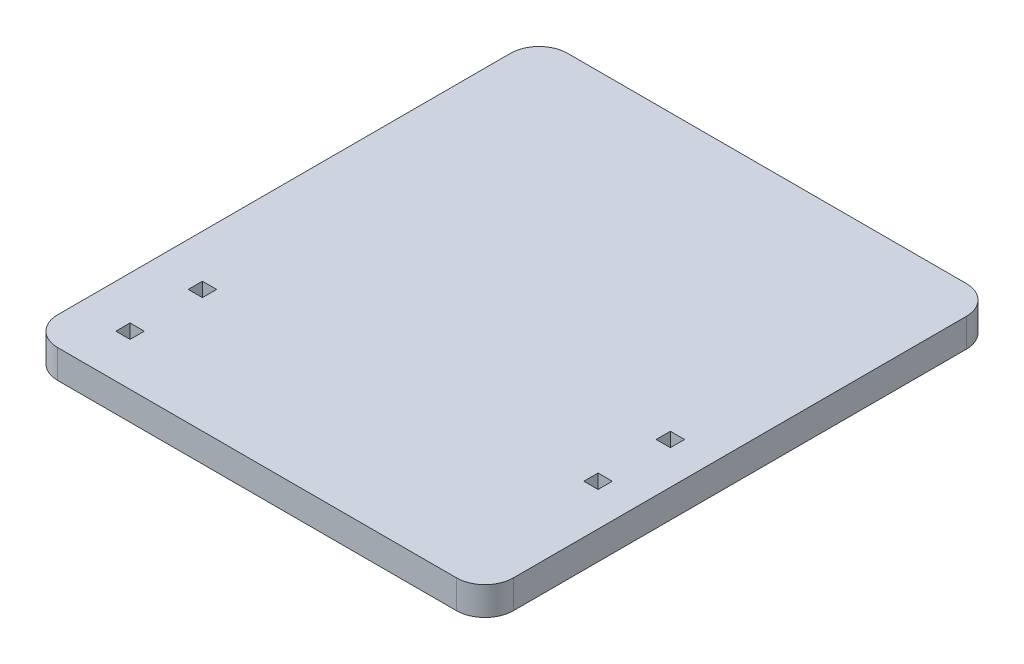
ISO-10303-21;
HEADER;
FILE_DESCRIPTION(('STEP AP214'),'2;1');
FILE_NAME('part.step','',(''),(''),'','','');
FILE_SCHEMA(('AUTOMOTIVE_DESIGN { 1 0 10303 214 1 1 1 1 }'));
ENDSEC;
DATA;
#1=APPLICATION_CONTEXT('core data for automotive mechanical design processes');
#2=APPLICATION_PROTOCOL_DEFINITION('international standard','automotive_design',2000,#1);
#3=PRODUCT_CONTEXT('',#1,'mechanical');
#4=PRODUCT('Part','Part','',(#3));
#5=PRODUCT_RELATED_PRODUCT_CATEGORY('part','',(#4));
#6=PRODUCT_DEFINITION_FORMATION('','',#4);
#7=PRODUCT_DEFINITION_CONTEXT('part definition',#1,'design');
#8=PRODUCT_DEFINITION('design','',#6,#7);
#9=PRODUCT_DEFINITION_SHAPE('','',#8);
#10=(LENGTH_UNIT() NAMED_UNIT(*) SI_UNIT(.MILLI.,.METRE.));
#11=(NAMED_UNIT(*) PLANE_ANGLE_UNIT() SI_UNIT($,.RADIAN.));
#12=(NAMED_UNIT(*) SI_UNIT($,.STERADIAN.) SOLID_ANGLE_UNIT());
#13=UNCERTAINTY_MEASURE_WITH_UNIT(LENGTH_MEASURE(1.E-05),#10,'distance_accuracy_value','');
#14=(GEOMETRIC_REPRESENTATION_CONTEXT(3) GLOBAL_UNCERTAINTY_ASSIGNED_CONTEXT((#13)) GLOBAL_UNIT_ASSIGNED_CONTEXT((#10,
#11,#12)) REPRESENTATION_CONTEXT('',''));
#15=CARTESIAN_POINT('',(0.,0.,0.));
#16=DIRECTION('',(0.,0.,1.));
#17=DIRECTION('',(1.,0.,0.));
#18=AXIS2_PLACEMENT_3D('',#15,#16,#17);
#19=CARTESIAN_POINT('',(15.,1.,-16.9));
#20=DIRECTION('',(0.,-1.,0.));
#21=DIRECTION('',(0.,0.,-1.));
#22=AXIS2_PLACEMENT_3D('',#19,#20,#21);
#23=PLANE('',#22);
#24=DIRECTION('',(0.,0.,-1.));
#25=VECTOR('',#24,1.);
#26=CARTESIAN_POINT('',(14.798,1.,-7.713));
#27=LINE('',#26,#25);
#28=CARTESIAN_POINT('',(14.798,1.,-7.713));
#29=VERTEX_POINT('',#28);
#30=CARTESIAN_POINT('',(14.798,1.,-8.213));
#31=VERTEX_POINT('',#30);
#32=EDGE_CURVE('E230',#29,#31,#27,.T.);
#33=ORIENTED_EDGE('',*,*,#32,.F.);
#34=DIRECTION('',(1.,0.,0.));
#35=VECTOR('',#34,1.);
#36=CARTESIAN_POINT('',(14.298,1.,-7.713));
#37=LINE('',#36,#35);
#38=CARTESIAN_POINT('',(14.298,1.,-7.713));
#39=VERTEX_POINT('',#38);
#40=EDGE_CURVE('E238',#39,#29,#37,.T.);
#41=ORIENTED_EDGE('',*,*,#40,.F.);
#42=DIRECTION('',(0.,0.,1.));
#43=VECTOR('',#42,1.);
#44=CARTESIAN_POINT('',(14.298,1.,-7.713));
#45=LINE('',#44,#43);
#46=CARTESIAN_POINT('',(14.298,1.,-8.213));
#47=VERTEX_POINT('',#46);
#48=EDGE_CURVE('E235',#47,#39,#45,.T.);
#49=ORIENTED_EDGE('',*,*,#48,.F.);
#50=DIRECTION('',(-1.,0.,0.));
#51=VECTOR('',#50,1.);
#52=CARTESIAN_POINT('',(14.298,1.,-8.213));
#53=LINE('',#52,#51);
#54=EDGE_CURVE('E232',#31,#47,#53,.T.);
#55=ORIENTED_EDGE('',*,*,#54,.F.);
#56=EDGE_LOOP('',(#33,#41,#49,#55));
#57=FACE_BOUND('',#56,.T.);
#58=DIRECTION('',(0.,0.,-1.));
#59=VECTOR('',#58,1.);
#60=CARTESIAN_POINT('',(2.02,1.,-1.52));
#61=LINE('',#60,#59);
#62=CARTESIAN_POINT('',(2.02,1.,-1.52));
#63=VERTEX_POINT('',#62);
#64=CARTESIAN_POINT('',(2.02,1.,-2.02));
#65=VERTEX_POINT('',#64);
#66=EDGE_CURVE('E292',#63,#65,#61,.T.);
#67=ORIENTED_EDGE('',*,*,#66,.F.);
#68=DIRECTION('',(1.,0.,0.));
#69=VECTOR('',#68,1.);
#70=CARTESIAN_POINT('',(1.52,1.,-1.52));
#71=LINE('',#70,#69);
#72=CARTESIAN_POINT('',(1.52,1.,-1.52));
#73=VERTEX_POINT('',#72);
#74=EDGE_CURVE('E300',#73,#63,#71,.T.);
#75=ORIENTED_EDGE('',*,*,#74,.F.);
#76=DIRECTION('',(0.,0.,1.));
#77=VECTOR('',#76,1.);
#78=CARTESIAN_POINT('',(1.52,1.,-1.52));
#79=LINE('',#78,#77);
#80=CARTESIAN_POINT('',(1.52,1.,-2.02));
#81=VERTEX_POINT('',#80);
#82=EDGE_CURVE('E297',#81,#73,#79,.T.);
#83=ORIENTED_EDGE('',*,*,#82,.F.);
#84=DIRECTION('',(-1.,0.,0.));
#85=VECTOR('',#84,1.);
#86=CARTESIAN_POINT('',(1.52,1.,-2.02));
#87=LINE('',#86,#85);
#88=EDGE_CURVE('E294',#65,#81,#87,.T.);
#89=ORIENTED_EDGE('',*,*,#88,.F.);
#90=EDGE_LOOP('',(#67,#75,#83,#89));
#91=FACE_BOUND('',#90,.T.);
#92=CARTESIAN_POINT('',(15.,1.,-16.9));
#93=DIRECTION('',(0.,1.,0.));
#94=DIRECTION('',(0.,0.,-1.));
#95=AXIS2_PLACEMENT_3D('',#92,#93,#94);
#96=CIRCLE('',#95,1.);
#97=CARTESIAN_POINT('',(16.,1.,-16.9));
#98=VERTEX_POINT('',#97);
#99=CARTESIAN_POINT('',(15.,1.,-17.9));
#100=VERTEX_POINT('',#99);
#101=EDGE_CURVE('E323',#98,#100,#96,.T.);
#102=ORIENTED_EDGE('',*,*,#101,.T.);
#103=DIRECTION('',(-1.,0.,0.));
#104=VECTOR('',#103,1.);
#105=CARTESIAN_POINT('',(1.00000000000001,1.,-17.9));
#106=LINE('',#105,#104);
#107=CARTESIAN_POINT('',(1.00000000000001,1.,-17.9));
#108=VERTEX_POINT('',#107);
#109=EDGE_CURVE('E326',#100,#108,#106,.T.);
#110=ORIENTED_EDGE('',*,*,#109,.T.);
#111=CARTESIAN_POINT('',(1.,1.,-16.9));
#112=DIRECTION('',(0.,1.,0.));
#113=DIRECTION('',(0.,0.,-1.));
#114=AXIS2_PLACEMENT_3D('',#111,#112,#113);
#115=CIRCLE('',#114,1.);
#116=CARTESIAN_POINT('',(0.,1.,-16.9));
#117=VERTEX_POINT('',#116);
#118=EDGE_CURVE('E329',#108,#117,#115,.T.);
#119=ORIENTED_EDGE('',*,*,#118,.T.);
#120=DIRECTION('',(0.,0.,1.));
#121=VECTOR('',#120,1.);
#122=CARTESIAN_POINT('',(0.,1.,-1.00000000000001));
#123=LINE('',#122,#121);
#124=CARTESIAN_POINT('',(0.,1.,-1.00000000000001));
#125=VERTEX_POINT('',#124);
#126=EDGE_CURVE('E331',#117,#125,#123,.T.);
#127=ORIENTED_EDGE('',*,*,#126,.T.);
#128=CARTESIAN_POINT('',(1.,1.,-1.));
#129=DIRECTION('',(0.,1.,0.));
#130=DIRECTION('',(0.,0.,-1.));
#131=AXIS2_PLACEMENT_3D('',#128,#129,#130);
#132=CIRCLE('',#131,1.);
#133=CARTESIAN_POINT('',(1.00000000000001,1.,0.));
#134=VERTEX_POINT('',#133);
#135=EDGE_CURVE('E333',#125,#134,#132,.T.);
#136=ORIENTED_EDGE('',*,*,#135,.T.);
#137=DIRECTION('',(1.,0.,0.));
#138=VECTOR('',#137,1.);
#139=CARTESIAN_POINT('',(1.00000000000001,1.,0.));
#140=LINE('',#139,#138);
#141=CARTESIAN_POINT('',(15.,1.,0.));
#142=VERTEX_POINT('',#141);
#143=EDGE_CURVE('E335',#134,#142,#140,.T.);
#144=ORIENTED_EDGE('',*,*,#143,.T.);
#145=CARTESIAN_POINT('',(15.,1.,-1.));
#146=DIRECTION('',(0.,1.,0.));
#147=DIRECTION('',(0.,0.,1.));
#148=AXIS2_PLACEMENT_3D('',#145,#146,#147);
#149=CIRCLE('',#148,1.);
#150=CARTESIAN_POINT('',(16.,1.,-1.00000000000001));
#151=VERTEX_POINT('',#150);
#152=EDGE_CURVE('E337',#142,#151,#149,.T.);
#153=ORIENTED_EDGE('',*,*,#152,.T.);
#154=DIRECTION('',(0.,0.,-1.));
#155=VECTOR('',#154,1.);
#156=CARTESIAN_POINT('',(16.,1.,-1.00000000000001));
#157=LINE('',#156,#155);
#158=EDGE_CURVE('E339',#151,#98,#157,.T.);
#159=ORIENTED_EDGE('',*,*,#158,.T.);
#160=EDGE_LOOP('',(#102,#110,#119,#127,#136,#144,#153,#159));
#161=FACE_BOUND('',#160,.T.);
#162=DIRECTION('',(0.,0.,-1.));
#163=VECTOR('',#162,1.);
#164=CARTESIAN_POINT('',(2.02,1.,-4.06));
#165=LINE('',#164,#163);
#166=CARTESIAN_POINT('',(2.02,1.,-4.06));
#167=VERTEX_POINT('',#166);
#168=CARTESIAN_POINT('',(2.02,1.,-4.56));
#169=VERTEX_POINT('',#168);
#170=EDGE_CURVE('E261',#167,#169,#165,.T.);
#171=ORIENTED_EDGE('',*,*,#170,.F.);
#172=DIRECTION('',(1.,0.,0.));
#173=VECTOR('',#172,1.);
#174=CARTESIAN_POINT('',(1.52,1.,-4.06));
#175=LINE('',#174,#173);
#176=CARTESIAN_POINT('',(1.52,1.,-4.06));
#177=VERTEX_POINT('',#176);
#178=EDGE_CURVE('E269',#177,#167,#175,.T.);
#179=ORIENTED_EDGE('',*,*,#178,.F.);
#180=DIRECTION('',(0.,0.,1.));
#181=VECTOR('',#180,1.);
#182=CARTESIAN_POINT('',(1.52,1.,-4.06));
#183=LINE('',#182,#181);
#184=CARTESIAN_POINT('',(1.52,1.,-4.56));
#185=VERTEX_POINT('',#184);
#186=EDGE_CURVE('E266',#185,#177,#183,.T.);
#187=ORIENTED_EDGE('',*,*,#186,.F.);
#188=DIRECTION('',(-1.,0.,0.));
#189=VECTOR('',#188,1.);
#190=CARTESIAN_POINT('',(1.52,1.,-4.56));
#191=LINE('',#190,#189);
#192=EDGE_CURVE('E263',#169,#185,#191,.T.);
#193=ORIENTED_EDGE('',*,*,#192,.F.);
#194=EDGE_LOOP('',(#171,#179,#187,#193));
#195=FACE_BOUND('',#194,.T.);
#196=DIRECTION('',(0.,0.,-1.));
#197=VECTOR('',#196,1.);
#198=CARTESIAN_POINT('',(14.798,1.,-5.173));
#199=LINE('',#198,#197);
#200=CARTESIAN_POINT('',(14.798,1.,-5.173));
#201=VERTEX_POINT('',#200);
#202=CARTESIAN_POINT('',(14.798,1.,-5.673));
#203=VERTEX_POINT('',#202);
#204=EDGE_CURVE('E194',#201,#203,#199,.T.);
#205=ORIENTED_EDGE('',*,*,#204,.F.);
#206=DIRECTION('',(1.,0.,0.));
#207=VECTOR('',#206,1.);
#208=CARTESIAN_POINT('',(14.298,1.,-5.173));
#209=LINE('',#208,#207);
#210=CARTESIAN_POINT('',(14.298,1.,-5.173));
#211=VERTEX_POINT('',#210);
#212=EDGE_CURVE('E216',#211,#201,#209,.T.);
#213=ORIENTED_EDGE('',*,*,#212,.F.);
#214=DIRECTION('',(0.,0.,1.));
#215=VECTOR('',#214,1.);
#216=CARTESIAN_POINT('',(14.298,1.,-5.173));
#217=LINE('',#216,#215);
#218=CARTESIAN_POINT('',(14.298,1.,-5.673));
#219=VERTEX_POINT('',#218);
#220=EDGE_CURVE('E214',#219,#211,#217,.T.);
#221=ORIENTED_EDGE('',*,*,#220,.F.);
#222=DIRECTION('',(-1.,0.,0.));
#223=VECTOR('',#222,1.);
#224=CARTESIAN_POINT('',(14.298,1.,-5.673));
#225=LINE('',#224,#223);
#226=EDGE_CURVE('E202',#203,#219,#225,.T.);
#227=ORIENTED_EDGE('',*,*,#226,.F.);
#228=EDGE_LOOP('',(#205,#213,#221,#227));
#229=FACE_BOUND('',#228,.T.);
#230=ADVANCED_FACE('F33',(#57,#91,#161,#195,#229),#23,.F.);
#231=CARTESIAN_POINT('',(15.,0.,-16.9));
#232=DIRECTION('',(0.,-1.,0.));
#233=DIRECTION('',(0.,0.,-1.));
#234=AXIS2_PLACEMENT_3D('',#231,#232,#233);
#235=PLANE('',#234);
#236=CARTESIAN_POINT('',(15.,0.,-16.9));
#237=DIRECTION('',(0.,1.,0.));
#238=DIRECTION('',(0.,0.,-1.));
#239=AXIS2_PLACEMENT_3D('',#236,#237,#238);
#240=CIRCLE('',#239,1.);
#241=CARTESIAN_POINT('',(16.,0.,-16.9));
#242=VERTEX_POINT('',#241);
#243=CARTESIAN_POINT('',(15.,0.,-17.9));
#244=VERTEX_POINT('',#243);
#245=EDGE_CURVE('E322',#242,#244,#240,.T.);
#246=ORIENTED_EDGE('',*,*,#245,.F.);
#247=DIRECTION('',(0.,0.,-1.));
#248=VECTOR('',#247,1.);
#249=CARTESIAN_POINT('',(16.,0.,-1.00000000000001));
#250=LINE('',#249,#248);
#251=CARTESIAN_POINT('',(16.,0.,-1.00000000000001));
#252=VERTEX_POINT('',#251);
#253=EDGE_CURVE('E327',#252,#242,#250,.T.);
#254=ORIENTED_EDGE('',*,*,#253,.F.);
#255=CARTESIAN_POINT('',(15.,0.,-1.));
#256=DIRECTION('',(0.,1.,0.));
#257=DIRECTION('',(0.,0.,1.));
#258=AXIS2_PLACEMENT_3D('',#255,#256,#257);
#259=CIRCLE('',#258,1.);
#260=CARTESIAN_POINT('',(15.,0.,0.));
#261=VERTEX_POINT('',#260);
#262=EDGE_CURVE('E354',#261,#252,#259,.T.);
#263=ORIENTED_EDGE('',*,*,#262,.F.);
#264=DIRECTION('',(1.,0.,0.));
#265=VECTOR('',#264,1.);
#266=CARTESIAN_POINT('',(1.00000000000001,0.,0.));
#267=LINE('',#266,#265);
#268=CARTESIAN_POINT('',(1.00000000000001,0.,0.));
#269=VERTEX_POINT('',#268);
#270=EDGE_CURVE('E352',#269,#261,#267,.T.);
#271=ORIENTED_EDGE('',*,*,#270,.F.);
#272=CARTESIAN_POINT('',(1.,0.,-1.));
#273=DIRECTION('',(0.,1.,0.));
#274=DIRECTION('',(0.,0.,-1.));
#275=AXIS2_PLACEMENT_3D('',#272,#273,#274);
#276=CIRCLE('',#275,1.);
#277=CARTESIAN_POINT('',(0.,0.,-1.00000000000001));
#278=VERTEX_POINT('',#277);
#279=EDGE_CURVE('E350',#278,#269,#276,.T.);
#280=ORIENTED_EDGE('',*,*,#279,.F.);
#281=DIRECTION('',(0.,0.,1.));
#282=VECTOR('',#281,1.);
#283=CARTESIAN_POINT('',(0.,0.,-1.00000000000001));
#284=LINE('',#283,#282);
#285=CARTESIAN_POINT('',(0.,0.,-16.9));
#286=VERTEX_POINT('',#285);
#287=EDGE_CURVE('E348',#286,#278,#284,.T.);
#288=ORIENTED_EDGE('',*,*,#287,.F.);
#289=CARTESIAN_POINT('',(1.,0.,-16.9));
#290=DIRECTION('',(0.,1.,0.));
#291=DIRECTION('',(0.,0.,-1.));
#292=AXIS2_PLACEMENT_3D('',#289,#290,#291);
#293=CIRCLE('',#292,1.);
#294=CARTESIAN_POINT('',(1.00000000000001,0.,-17.9));
#295=VERTEX_POINT('',#294);
#296=EDGE_CURVE('E346',#295,#286,#293,.T.);
#297=ORIENTED_EDGE('',*,*,#296,.F.);
#298=DIRECTION('',(-1.,0.,0.));
#299=VECTOR('',#298,1.);
#300=CARTESIAN_POINT('',(1.00000000000001,0.,-17.9));
#301=LINE('',#300,#299);
#302=EDGE_CURVE('E344',#244,#295,#301,.T.);
#303=ORIENTED_EDGE('',*,*,#302,.F.);
#304=EDGE_LOOP('',(#246,#254,#263,#271,#280,#288,#297,#303));
#305=FACE_BOUND('',#304,.T.);
#306=DIRECTION('',(1.,0.,0.));
#307=VECTOR('',#306,1.);
#308=CARTESIAN_POINT('',(1.52,0.,-1.52));
#309=LINE('',#308,#307);
#310=CARTESIAN_POINT('',(1.52,0.,-1.52));
#311=VERTEX_POINT('',#310);
#312=CARTESIAN_POINT('',(2.02,0.,-1.52));
#313=VERTEX_POINT('',#312);
#314=EDGE_CURVE('E295',#311,#313,#309,.T.);
#315=ORIENTED_EDGE('',*,*,#314,.T.);
#316=DIRECTION('',(0.,0.,-1.));
#317=VECTOR('',#316,1.);
#318=CARTESIAN_POINT('',(2.02,0.,-1.52));
#319=LINE('',#318,#317);
#320=CARTESIAN_POINT('',(2.02,0.,-2.02));
#321=VERTEX_POINT('',#320);
#322=EDGE_CURVE('E291',#313,#321,#319,.T.);
#323=ORIENTED_EDGE('',*,*,#322,.T.);
#324=DIRECTION('',(-1.,0.,0.));
#325=VECTOR('',#324,1.);
#326=CARTESIAN_POINT('',(1.52,0.,-2.02));
#327=LINE('',#326,#325);
#328=CARTESIAN_POINT('',(1.52,0.,-2.02));
#329=VERTEX_POINT('',#328);
#330=EDGE_CURVE('E305',#321,#329,#327,.T.);
#331=ORIENTED_EDGE('',*,*,#330,.T.);
#332=DIRECTION('',(0.,0.,1.));
#333=VECTOR('',#332,1.);
#334=CARTESIAN_POINT('',(1.52,0.,-1.52));
#335=LINE('',#334,#333);
#336=EDGE_CURVE('E308',#329,#311,#335,.T.);
#337=ORIENTED_EDGE('',*,*,#336,.T.);
#338=EDGE_LOOP('',(#315,#323,#331,#337));
#339=FACE_BOUND('',#338,.T.);
#340=DIRECTION('',(1.,0.,0.));
#341=VECTOR('',#340,1.);
#342=CARTESIAN_POINT('',(1.52,0.,-4.06));
#343=LINE('',#342,#341);
#344=CARTESIAN_POINT('',(1.52,0.,-4.06));
#345=VERTEX_POINT('',#344);
#346=CARTESIAN_POINT('',(2.02,0.,-4.06));
#347=VERTEX_POINT('',#346);
#348=EDGE_CURVE('E264',#345,#347,#343,.T.);
#349=ORIENTED_EDGE('',*,*,#348,.T.);
#350=DIRECTION('',(0.,0.,-1.));
#351=VECTOR('',#350,1.);
#352=CARTESIAN_POINT('',(2.02,0.,-4.06));
#353=LINE('',#352,#351);
#354=CARTESIAN_POINT('',(2.02,0.,-4.56));
#355=VERTEX_POINT('',#354);
#356=EDGE_CURVE('E260',#347,#355,#353,.T.);
#357=ORIENTED_EDGE('',*,*,#356,.T.);
#358=DIRECTION('',(-1.,0.,0.));
#359=VECTOR('',#358,1.);
#360=CARTESIAN_POINT('',(1.52,0.,-4.56));
#361=LINE('',#360,#359);
#362=CARTESIAN_POINT('',(1.52,0.,-4.56));
#363=VERTEX_POINT('',#362);
#364=EDGE_CURVE('E274',#355,#363,#361,.T.);
#365=ORIENTED_EDGE('',*,*,#364,.T.);
#366=DIRECTION('',(0.,0.,1.));
#367=VECTOR('',#366,1.);
#368=CARTESIAN_POINT('',(1.52,0.,-4.06));
#369=LINE('',#368,#367);
#370=EDGE_CURVE('E277',#363,#345,#369,.T.);
#371=ORIENTED_EDGE('',*,*,#370,.T.);
#372=EDGE_LOOP('',(#349,#357,#365,#371));
#373=FACE_BOUND('',#372,.T.);
#374=DIRECTION('',(1.,0.,0.));
#375=VECTOR('',#374,1.);
#376=CARTESIAN_POINT('',(14.298,0.,-7.713));
#377=LINE('',#376,#375);
#378=CARTESIAN_POINT('',(14.298,0.,-7.713));
#379=VERTEX_POINT('',#378);
#380=CARTESIAN_POINT('',(14.798,0.,-7.713));
#381=VERTEX_POINT('',#380);
#382=EDGE_CURVE('E233',#379,#381,#377,.T.);
#383=ORIENTED_EDGE('',*,*,#382,.T.);
#384=DIRECTION('',(0.,0.,-1.));
#385=VECTOR('',#384,1.);
#386=CARTESIAN_POINT('',(14.798,0.,-7.713));
#387=LINE('',#386,#385);
#388=CARTESIAN_POINT('',(14.798,0.,-8.213));
#389=VERTEX_POINT('',#388);
#390=EDGE_CURVE('E210',#381,#389,#387,.T.);
#391=ORIENTED_EDGE('',*,*,#390,.T.);
#392=DIRECTION('',(-1.,0.,0.));
#393=VECTOR('',#392,1.);
#394=CARTESIAN_POINT('',(14.298,0.,-8.213));
#395=LINE('',#394,#393);
#396=CARTESIAN_POINT('',(14.298,0.,-8.213));
#397=VERTEX_POINT('',#396);
#398=EDGE_CURVE('E243',#389,#397,#395,.T.);
#399=ORIENTED_EDGE('',*,*,#398,.T.);
#400=DIRECTION('',(0.,0.,1.));
#401=VECTOR('',#400,1.);
#402=CARTESIAN_POINT('',(14.298,0.,-7.713));
#403=LINE('',#402,#401);
#404=EDGE_CURVE('E246',#397,#379,#403,.T.);
#405=ORIENTED_EDGE('',*,*,#404,.T.);
#406=EDGE_LOOP('',(#383,#391,#399,#405));
#407=FACE_BOUND('',#406,.T.);
#408=DIRECTION('',(1.,0.,0.));
#409=VECTOR('',#408,1.);
#410=CARTESIAN_POINT('',(14.298,0.,-5.173));
#411=LINE('',#410,#409);
#412=CARTESIAN_POINT('',(14.298,0.,-5.173));
#413=VERTEX_POINT('',#412);
#414=CARTESIAN_POINT('',(14.798,0.,-5.173));
#415=VERTEX_POINT('',#414);
#416=EDGE_CURVE('E203',#413,#415,#411,.T.);
#417=ORIENTED_EDGE('',*,*,#416,.T.);
#418=DIRECTION('',(0.,0.,-1.));
#419=VECTOR('',#418,1.);
#420=CARTESIAN_POINT('',(14.798,0.,-5.173));
#421=LINE('',#420,#419);
#422=CARTESIAN_POINT('',(14.798,0.,-5.673));
#423=VERTEX_POINT('',#422);
#424=EDGE_CURVE('E56',#415,#423,#421,.T.);
#425=ORIENTED_EDGE('',*,*,#424,.T.);
#426=DIRECTION('',(-1.,0.,0.));
#427=VECTOR('',#426,1.);
#428=CARTESIAN_POINT('',(14.298,0.,-5.673));
#429=LINE('',#428,#427);
#430=CARTESIAN_POINT('',(14.298,0.,-5.673));
#431=VERTEX_POINT('',#430);
#432=EDGE_CURVE('E209',#423,#431,#429,.T.);
#433=ORIENTED_EDGE('',*,*,#432,.T.);
#434=DIRECTION('',(0.,0.,1.));
#435=VECTOR('',#434,1.);
#436=CARTESIAN_POINT('',(14.298,0.,-5.173));
#437=LINE('',#436,#435);
#438=EDGE_CURVE('E222',#431,#413,#437,.T.);
#439=ORIENTED_EDGE('',*,*,#438,.T.);
#440=EDGE_LOOP('',(#417,#425,#433,#439));
#441=FACE_BOUND('',#440,.T.);
#442=ADVANCED_FACE('F384',(#305,#339,#373,#407,#441),#235,.T.);
#443=CARTESIAN_POINT('',(15.,1.,-16.9));
#444=DIRECTION('',(0.,-1.,0.));
#445=DIRECTION('',(0.,0.,-1.));
#446=AXIS2_PLACEMENT_3D('',#443,#444,#445);
#447=CYLINDRICAL_SURFACE('',#446,1.);
#448=ORIENTED_EDGE('',*,*,#245,.T.);
#449=DIRECTION('',(0.,-1.,0.));
#450=VECTOR('',#449,1.);
#451=CARTESIAN_POINT('',(15.,1.,-17.9));
#452=LINE('',#451,#450);
#453=EDGE_CURVE('E11',#100,#244,#452,.T.);
#454=ORIENTED_EDGE('',*,*,#453,.F.);
#455=ORIENTED_EDGE('',*,*,#101,.F.);
#456=DIRECTION('',(0.,-1.,0.));
#457=VECTOR('',#456,1.);
#458=CARTESIAN_POINT('',(16.,1.,-16.9));
#459=LINE('',#458,#457);
#460=EDGE_CURVE('E341',#98,#242,#459,.T.);
#461=ORIENTED_EDGE('',*,*,#460,.T.);
#462=EDGE_LOOP('',(#448,#454,#455,#461));
#463=FACE_BOUND('',#462,.T.);
#464=ADVANCED_FACE('F35',(#463),#447,.T.);
#465=CARTESIAN_POINT('',(1.00000000000001,1.,-17.9));
#466=DIRECTION('',(0.,0.,1.));
#467=DIRECTION('',(1.,0.,0.));
#468=AXIS2_PLACEMENT_3D('',#465,#466,#467);
#469=PLANE('',#468);
#470=ORIENTED_EDGE('',*,*,#302,.T.);
#471=DIRECTION('',(0.,-1.,0.));
#472=VECTOR('',#471,1.);
#473=CARTESIAN_POINT('',(1.00000000000001,1.,-17.9));
#474=LINE('',#473,#472);
#475=EDGE_CURVE('E41',#108,#295,#474,.T.);
#476=ORIENTED_EDGE('',*,*,#475,.F.);
#477=ORIENTED_EDGE('',*,*,#109,.F.);
#478=ORIENTED_EDGE('',*,*,#453,.T.);
#479=EDGE_LOOP('',(#470,#476,#477,#478));
#480=FACE_BOUND('',#479,.T.);
#481=ADVANCED_FACE('F402',(#480),#469,.F.);
#482=CARTESIAN_POINT('',(1.,1.,-16.9));
#483=DIRECTION('',(0.,-1.,0.));
#484=DIRECTION('',(0.,0.,-1.));
#485=AXIS2_PLACEMENT_3D('',#482,#483,#484);
#486=CYLINDRICAL_SURFACE('',#485,1.);
#487=ORIENTED_EDGE('',*,*,#296,.T.);
#488=DIRECTION('',(0.,-1.,0.));
#489=VECTOR('',#488,1.);
#490=CARTESIAN_POINT('',(0.,1.,-16.9));
#491=LINE('',#490,#489);
#492=EDGE_CURVE('E371',#117,#286,#491,.T.);
#493=ORIENTED_EDGE('',*,*,#492,.F.);
#494=ORIENTED_EDGE('',*,*,#118,.F.);
#495=ORIENTED_EDGE('',*,*,#475,.T.);
#496=EDGE_LOOP('',(#487,#493,#494,#495));
#497=FACE_BOUND('',#496,.T.);
#498=ADVANCED_FACE('F378',(#497),#486,.T.);
#499=CARTESIAN_POINT('',(0.,1.,-1.00000000000001));
#500=DIRECTION('',(1.,0.,0.));
#501=DIRECTION('',(0.,0.,-1.));
#502=AXIS2_PLACEMENT_3D('',#499,#500,#501);
#503=PLANE('',#502);
#504=ORIENTED_EDGE('',*,*,#287,.T.);
#505=DIRECTION('',(0.,-1.,0.));
#506=VECTOR('',#505,1.);
#507=CARTESIAN_POINT('',(0.,1.,-1.00000000000001));
#508=LINE('',#507,#506);
#509=EDGE_CURVE('E368',#125,#278,#508,.T.);
#510=ORIENTED_EDGE('',*,*,#509,.F.);
#511=ORIENTED_EDGE('',*,*,#126,.F.);
#512=ORIENTED_EDGE('',*,*,#492,.T.);
#513=EDGE_LOOP('',(#504,#510,#511,#512));
#514=FACE_BOUND('',#513,.T.);
#515=ADVANCED_FACE('F390',(#514),#503,.F.);
#516=CARTESIAN_POINT('',(1.,1.,-1.));
#517=DIRECTION('',(0.,-1.,0.));
#518=DIRECTION('',(0.,0.,-1.));
#519=AXIS2_PLACEMENT_3D('',#516,#517,#518);
#520=CYLINDRICAL_SURFACE('',#519,1.);
#521=ORIENTED_EDGE('',*,*,#279,.T.);
#522=DIRECTION('',(0.,-1.,0.));
#523=VECTOR('',#522,1.);
#524=CARTESIAN_POINT('',(1.00000000000001,1.,0.));
#525=LINE('',#524,#523);
#526=EDGE_CURVE('E365',#134,#269,#525,.T.);
#527=ORIENTED_EDGE('',*,*,#526,.F.);
#528=ORIENTED_EDGE('',*,*,#135,.F.);
#529=ORIENTED_EDGE('',*,*,#509,.T.);
#530=EDGE_LOOP('',(#521,#527,#528,#529));
#531=FACE_BOUND('',#530,.T.);
#532=ADVANCED_FACE('F394',(#531),#520,.T.);
#533=CARTESIAN_POINT('',(1.00000000000001,1.,0.));
#534=DIRECTION('',(0.,0.,-1.));
#535=DIRECTION('',(-1.,0.,0.));
#536=AXIS2_PLACEMENT_3D('',#533,#534,#535);
#537=PLANE('',#536);
#538=ORIENTED_EDGE('',*,*,#270,.T.);
#539=DIRECTION('',(0.,-1.,0.));
#540=VECTOR('',#539,1.);
#541=CARTESIAN_POINT('',(15.,1.,0.));
#542=LINE('',#541,#540);
#543=EDGE_CURVE('E362',#142,#261,#542,.T.);
#544=ORIENTED_EDGE('',*,*,#543,.F.);
#545=ORIENTED_EDGE('',*,*,#143,.F.);
#546=ORIENTED_EDGE('',*,*,#526,.T.);
#547=EDGE_LOOP('',(#538,#544,#545,#546));
#548=FACE_BOUND('',#547,.T.);
#549=ADVANCED_FACE('F415',(#548),#537,.F.);
#550=CARTESIAN_POINT('',(15.,1.,-1.));
#551=DIRECTION('',(0.,-1.,0.));
#552=DIRECTION('',(0.,0.,-1.));
#553=AXIS2_PLACEMENT_3D('',#550,#551,#552);
#554=CYLINDRICAL_SURFACE('',#553,1.);
#555=ORIENTED_EDGE('',*,*,#262,.T.);
#556=DIRECTION('',(0.,-1.,0.));
#557=VECTOR('',#556,1.);
#558=CARTESIAN_POINT('',(16.,1.,-1.00000000000001));
#559=LINE('',#558,#557);
#560=EDGE_CURVE('E359',#151,#252,#559,.T.);
#561=ORIENTED_EDGE('',*,*,#560,.F.);
#562=ORIENTED_EDGE('',*,*,#152,.F.);
#563=ORIENTED_EDGE('',*,*,#543,.T.);
#564=EDGE_LOOP('',(#555,#561,#562,#563));
#565=FACE_BOUND('',#564,.T.);
#566=ADVANCED_FACE('F413',(#565),#554,.T.);
#567=CARTESIAN_POINT('',(16.,1.,-1.00000000000001));
#568=DIRECTION('',(-1.,0.,0.));
#569=DIRECTION('',(0.,0.,1.));
#570=AXIS2_PLACEMENT_3D('',#567,#568,#569);
#571=PLANE('',#570);
#572=ORIENTED_EDGE('',*,*,#253,.T.);
#573=ORIENTED_EDGE('',*,*,#460,.F.);
#574=ORIENTED_EDGE('',*,*,#158,.F.);
#575=ORIENTED_EDGE('',*,*,#560,.T.);
#576=EDGE_LOOP('',(#572,#573,#574,#575));
#577=FACE_BOUND('',#576,.T.);
#578=ADVANCED_FACE('F408',(#577),#571,.F.);
#579=CARTESIAN_POINT('',(2.02,1.,-1.52));
#580=DIRECTION('',(-1.,0.,0.));
#581=DIRECTION('',(0.,0.,1.));
#582=AXIS2_PLACEMENT_3D('',#579,#580,#581);
#583=PLANE('',#582);
#584=ORIENTED_EDGE('',*,*,#322,.F.);
#585=DIRECTION('',(0.,-1.,0.));
#586=VECTOR('',#585,1.);
#587=CARTESIAN_POINT('',(2.02,1.,-1.52));
#588=LINE('',#587,#586);
#589=EDGE_CURVE('E302',#63,#313,#588,.T.);
#590=ORIENTED_EDGE('',*,*,#589,.F.);
#591=ORIENTED_EDGE('',*,*,#66,.T.);
#592=DIRECTION('',(0.,-1.,0.));
#593=VECTOR('',#592,1.);
#594=CARTESIAN_POINT('',(2.02,1.,-2.02));
#595=LINE('',#594,#593);
#596=EDGE_CURVE('E319',#65,#321,#595,.T.);
#597=ORIENTED_EDGE('',*,*,#596,.T.);
#598=EDGE_LOOP('',(#584,#590,#591,#597));
#599=FACE_BOUND('',#598,.T.);
#600=ADVANCED_FACE('F434',(#599),#583,.T.);
#601=CARTESIAN_POINT('',(1.52,1.,-2.02));
#602=DIRECTION('',(0.,0.,1.));
#603=DIRECTION('',(1.,0.,0.));
#604=AXIS2_PLACEMENT_3D('',#601,#602,#603);
#605=PLANE('',#604);
#606=ORIENTED_EDGE('',*,*,#330,.F.);
#607=ORIENTED_EDGE('',*,*,#596,.F.);
#608=ORIENTED_EDGE('',*,*,#88,.T.);
#609=DIRECTION('',(0.,-1.,0.));
#610=VECTOR('',#609,1.);
#611=CARTESIAN_POINT('',(1.52,1.,-2.02));
#612=LINE('',#611,#610);
#613=EDGE_CURVE('E317',#81,#329,#612,.T.);
#614=ORIENTED_EDGE('',*,*,#613,.T.);
#615=EDGE_LOOP('',(#606,#607,#608,#614));
#616=FACE_BOUND('',#615,.T.);
#617=ADVANCED_FACE('F441',(#616),#605,.T.);
#618=CARTESIAN_POINT('',(1.52,1.,-1.52));
#619=DIRECTION('',(1.,0.,0.));
#620=DIRECTION('',(0.,0.,-1.));
#621=AXIS2_PLACEMENT_3D('',#618,#619,#620);
#622=PLANE('',#621);
#623=ORIENTED_EDGE('',*,*,#336,.F.);
#624=ORIENTED_EDGE('',*,*,#613,.F.);
#625=ORIENTED_EDGE('',*,*,#82,.T.);
#626=DIRECTION('',(0.,-1.,0.));
#627=VECTOR('',#626,1.);
#628=CARTESIAN_POINT('',(1.52,1.,-1.52));
#629=LINE('',#628,#627);
#630=EDGE_CURVE('E315',#73,#311,#629,.T.);
#631=ORIENTED_EDGE('',*,*,#630,.T.);
#632=EDGE_LOOP('',(#623,#624,#625,#631));
#633=FACE_BOUND('',#632,.T.);
#634=ADVANCED_FACE('F446',(#633),#622,.T.);
#635=CARTESIAN_POINT('',(1.52,1.,-1.52));
#636=DIRECTION('',(0.,0.,-1.));
#637=DIRECTION('',(-1.,0.,0.));
#638=AXIS2_PLACEMENT_3D('',#635,#636,#637);
#639=PLANE('',#638);
#640=ORIENTED_EDGE('',*,*,#314,.F.);
#641=ORIENTED_EDGE('',*,*,#630,.F.);
#642=ORIENTED_EDGE('',*,*,#74,.T.);
#643=ORIENTED_EDGE('',*,*,#589,.T.);
#644=EDGE_LOOP('',(#640,#641,#642,#643));
#645=FACE_BOUND('',#644,.T.);
#646=ADVANCED_FACE('F453',(#645),#639,.T.);
#647=CARTESIAN_POINT('',(2.02,1.,-4.06));
#648=DIRECTION('',(-1.,0.,0.));
#649=DIRECTION('',(0.,0.,1.));
#650=AXIS2_PLACEMENT_3D('',#647,#648,#649);
#651=PLANE('',#650);
#652=ORIENTED_EDGE('',*,*,#356,.F.);
#653=DIRECTION('',(0.,-1.,0.));
#654=VECTOR('',#653,1.);
#655=CARTESIAN_POINT('',(2.02,1.,-4.06));
#656=LINE('',#655,#654);
#657=EDGE_CURVE('E271',#167,#347,#656,.T.);
#658=ORIENTED_EDGE('',*,*,#657,.F.);
#659=ORIENTED_EDGE('',*,*,#170,.T.);
#660=DIRECTION('',(0.,-1.,0.));
#661=VECTOR('',#660,1.);
#662=CARTESIAN_POINT('',(2.02,1.,-4.56));
#663=LINE('',#662,#661);
#664=EDGE_CURVE('E288',#169,#355,#663,.T.);
#665=ORIENTED_EDGE('',*,*,#664,.T.);
#666=EDGE_LOOP('',(#652,#658,#659,#665));
#667=FACE_BOUND('',#666,.T.);
#668=ADVANCED_FACE('F466',(#667),#651,.T.);
#669=CARTESIAN_POINT('',(1.52,1.,-4.56));
#670=DIRECTION('',(0.,0.,1.));
#671=DIRECTION('',(1.,0.,0.));
#672=AXIS2_PLACEMENT_3D('',#669,#670,#671);
#673=PLANE('',#672);
#674=ORIENTED_EDGE('',*,*,#364,.F.);
#675=ORIENTED_EDGE('',*,*,#664,.F.);
#676=ORIENTED_EDGE('',*,*,#192,.T.);
#677=DIRECTION('',(0.,-1.,0.));
#678=VECTOR('',#677,1.);
#679=CARTESIAN_POINT('',(1.52,1.,-4.56));
#680=LINE('',#679,#678);
#681=EDGE_CURVE('E286',#185,#363,#680,.T.);
#682=ORIENTED_EDGE('',*,*,#681,.T.);
#683=EDGE_LOOP('',(#674,#675,#676,#682));
#684=FACE_BOUND('',#683,.T.);
#685=ADVANCED_FACE('F471',(#684),#673,.T.);
#686=CARTESIAN_POINT('',(1.52,1.,-4.06));
#687=DIRECTION('',(1.,0.,0.));
#688=DIRECTION('',(0.,0.,-1.));
#689=AXIS2_PLACEMENT_3D('',#686,#687,#688);
#690=PLANE('',#689);
#691=ORIENTED_EDGE('',*,*,#370,.F.);
#692=ORIENTED_EDGE('',*,*,#681,.F.);
#693=ORIENTED_EDGE('',*,*,#186,.T.);
#694=DIRECTION('',(0.,-1.,0.));
#695=VECTOR('',#694,1.);
#696=CARTESIAN_POINT('',(1.52,1.,-4.06));
#697=LINE('',#696,#695);
#698=EDGE_CURVE('E284',#177,#345,#697,.T.);
#699=ORIENTED_EDGE('',*,*,#698,.T.);
#700=EDGE_LOOP('',(#691,#692,#693,#699));
#701=FACE_BOUND('',#700,.T.);
#702=ADVANCED_FACE('F475',(#701),#690,.T.);
#703=CARTESIAN_POINT('',(1.52,1.,-4.06));
#704=DIRECTION('',(0.,0.,-1.));
#705=DIRECTION('',(-1.,0.,0.));
#706=AXIS2_PLACEMENT_3D('',#703,#704,#705);
#707=PLANE('',#706);
#708=ORIENTED_EDGE('',*,*,#348,.F.);
#709=ORIENTED_EDGE('',*,*,#698,.F.);
#710=ORIENTED_EDGE('',*,*,#178,.T.);
#711=ORIENTED_EDGE('',*,*,#657,.T.);
#712=EDGE_LOOP('',(#708,#709,#710,#711));
#713=FACE_BOUND('',#712,.T.);
#714=ADVANCED_FACE('F479',(#713),#707,.T.);
#715=CARTESIAN_POINT('',(14.798,1.,-7.713));
#716=DIRECTION('',(-1.,0.,0.));
#717=DIRECTION('',(0.,0.,1.));
#718=AXIS2_PLACEMENT_3D('',#715,#716,#717);
#719=PLANE('',#718);
#720=ORIENTED_EDGE('',*,*,#390,.F.);
#721=DIRECTION('',(0.,-1.,0.));
#722=VECTOR('',#721,1.);
#723=CARTESIAN_POINT('',(14.798,1.,-7.713));
#724=LINE('',#723,#722);
#725=EDGE_CURVE('E240',#29,#381,#724,.T.);
#726=ORIENTED_EDGE('',*,*,#725,.F.);
#727=ORIENTED_EDGE('',*,*,#32,.T.);
#728=DIRECTION('',(0.,-1.,0.));
#729=VECTOR('',#728,1.);
#730=CARTESIAN_POINT('',(14.798,1.,-8.213));
#731=LINE('',#730,#729);
#732=EDGE_CURVE('E257',#31,#389,#731,.T.);
#733=ORIENTED_EDGE('',*,*,#732,.T.);
#734=EDGE_LOOP('',(#720,#726,#727,#733));
#735=FACE_BOUND('',#734,.T.);
#736=ADVANCED_FACE('F483',(#735),#719,.T.);
#737=CARTESIAN_POINT('',(14.298,1.,-8.213));
#738=DIRECTION('',(0.,0.,1.));
#739=DIRECTION('',(1.,0.,0.));
#740=AXIS2_PLACEMENT_3D('',#737,#738,#739);
#741=PLANE('',#740);
#742=ORIENTED_EDGE('',*,*,#398,.F.);
#743=ORIENTED_EDGE('',*,*,#732,.F.);
#744=ORIENTED_EDGE('',*,*,#54,.T.);
#745=DIRECTION('',(0.,-1.,0.));
#746=VECTOR('',#745,1.);
#747=CARTESIAN_POINT('',(14.298,1.,-8.213));
#748=LINE('',#747,#746);
#749=EDGE_CURVE('E255',#47,#397,#748,.T.);
#750=ORIENTED_EDGE('',*,*,#749,.T.);
#751=EDGE_LOOP('',(#742,#743,#744,#750));
#752=FACE_BOUND('',#751,.T.);
#753=ADVANCED_FACE('F487',(#752),#741,.T.);
#754=CARTESIAN_POINT('',(14.298,1.,-7.713));
#755=DIRECTION('',(1.,0.,0.));
#756=DIRECTION('',(0.,0.,-1.));
#757=AXIS2_PLACEMENT_3D('',#754,#755,#756);
#758=PLANE('',#757);
#759=ORIENTED_EDGE('',*,*,#404,.F.);
#760=ORIENTED_EDGE('',*,*,#749,.F.);
#761=ORIENTED_EDGE('',*,*,#48,.T.);
#762=DIRECTION('',(0.,-1.,0.));
#763=VECTOR('',#762,1.);
#764=CARTESIAN_POINT('',(14.298,1.,-7.713));
#765=LINE('',#764,#763);
#766=EDGE_CURVE('E253',#39,#379,#765,.T.);
#767=ORIENTED_EDGE('',*,*,#766,.T.);
#768=EDGE_LOOP('',(#759,#760,#761,#767));
#769=FACE_BOUND('',#768,.T.);
#770=ADVANCED_FACE('F491',(#769),#758,.T.);
#771=CARTESIAN_POINT('',(14.298,1.,-7.713));
#772=DIRECTION('',(0.,0.,-1.));
#773=DIRECTION('',(-1.,0.,0.));
#774=AXIS2_PLACEMENT_3D('',#771,#772,#773);
#775=PLANE('',#774);
#776=ORIENTED_EDGE('',*,*,#382,.F.);
#777=ORIENTED_EDGE('',*,*,#766,.F.);
#778=ORIENTED_EDGE('',*,*,#40,.T.);
#779=ORIENTED_EDGE('',*,*,#725,.T.);
#780=EDGE_LOOP('',(#776,#777,#778,#779));
#781=FACE_BOUND('',#780,.T.);
#782=ADVANCED_FACE('F495',(#781),#775,.T.);
#783=CARTESIAN_POINT('',(14.798,1.,-5.173));
#784=DIRECTION('',(-1.,0.,0.));
#785=DIRECTION('',(0.,0.,1.));
#786=AXIS2_PLACEMENT_3D('',#783,#784,#785);
#787=PLANE('',#786);
#788=ORIENTED_EDGE('',*,*,#424,.F.);
#789=DIRECTION('',(0.,-1.,0.));
#790=VECTOR('',#789,1.);
#791=CARTESIAN_POINT('',(14.798,1.,-5.173));
#792=LINE('',#791,#790);
#793=EDGE_CURVE('E198',#201,#415,#792,.T.);
#794=ORIENTED_EDGE('',*,*,#793,.F.);
#795=ORIENTED_EDGE('',*,*,#204,.T.);
#796=DIRECTION('',(0.,-1.,0.));
#797=VECTOR('',#796,1.);
#798=CARTESIAN_POINT('',(14.798,1.,-5.673));
#799=LINE('',#798,#797);
#800=EDGE_CURVE('E197',#203,#423,#799,.T.);
#801=ORIENTED_EDGE('',*,*,#800,.T.);
#802=EDGE_LOOP('',(#788,#794,#795,#801));
#803=FACE_BOUND('',#802,.T.);
#804=ADVANCED_FACE('F196',(#803),#787,.T.);
#805=CARTESIAN_POINT('',(14.298,1.,-5.673));
#806=DIRECTION('',(0.,0.,1.));
#807=DIRECTION('',(1.,0.,0.));
#808=AXIS2_PLACEMENT_3D('',#805,#806,#807);
#809=PLANE('',#808);
#810=ORIENTED_EDGE('',*,*,#432,.F.);
#811=ORIENTED_EDGE('',*,*,#800,.F.);
#812=ORIENTED_EDGE('',*,*,#226,.T.);
#813=DIRECTION('',(0.,-1.,0.));
#814=VECTOR('',#813,1.);
#815=CARTESIAN_POINT('',(14.298,1.,-5.673));
#816=LINE('',#815,#814);
#817=EDGE_CURVE('E211',#219,#431,#816,.T.);
#818=ORIENTED_EDGE('',*,*,#817,.T.);
#819=EDGE_LOOP('',(#810,#811,#812,#818));
#820=FACE_BOUND('',#819,.T.);
#821=ADVANCED_FACE('F206',(#820),#809,.T.);
#822=CARTESIAN_POINT('',(14.298,1.,-5.173));
#823=DIRECTION('',(1.,0.,0.));
#824=DIRECTION('',(0.,0.,-1.));
#825=AXIS2_PLACEMENT_3D('',#822,#823,#824);
#826=PLANE('',#825);
#827=ORIENTED_EDGE('',*,*,#438,.F.);
#828=ORIENTED_EDGE('',*,*,#817,.F.);
#829=ORIENTED_EDGE('',*,*,#220,.T.);
#830=DIRECTION('',(0.,-1.,0.));
#831=VECTOR('',#830,1.);
#832=CARTESIAN_POINT('',(14.298,1.,-5.173));
#833=LINE('',#832,#831);
#834=EDGE_CURVE('E48',#211,#413,#833,.T.);
#835=ORIENTED_EDGE('',*,*,#834,.T.);
#836=EDGE_LOOP('',(#827,#828,#829,#835));
#837=FACE_BOUND('',#836,.T.);
#838=ADVANCED_FACE('F504',(#837),#826,.T.);
#839=CARTESIAN_POINT('',(14.298,1.,-5.173));
#840=DIRECTION('',(0.,0.,-1.));
#841=DIRECTION('',(-1.,0.,0.));
#842=AXIS2_PLACEMENT_3D('',#839,#840,#841);
#843=PLANE('',#842);
#844=ORIENTED_EDGE('',*,*,#416,.F.);
#845=ORIENTED_EDGE('',*,*,#834,.F.);
#846=ORIENTED_EDGE('',*,*,#212,.T.);
#847=ORIENTED_EDGE('',*,*,#793,.T.);
#848=EDGE_LOOP('',(#844,#845,#846,#847));
#849=FACE_BOUND('',#848,.T.);
#850=ADVANCED_FACE('F507',(#849),#843,.T.);
#851=CLOSED_SHELL('',(#230,#442,#464,#481,#498,#515,#532,#549,#566,#578,#600,#617,#634,#646,
#668,#685,#702,#714,#736,#753,#770,#782,#804,#821,#838,#850));
#852=MANIFOLD_SOLID_BREP('B2',#851);
#853=ADVANCED_BREP_SHAPE_REPRESENTATION('',(#18,#852),#14);
#854=SHAPE_DEFINITION_REPRESENTATION(#9,#853);
ENDSEC;
END-ISO-10303-21;
